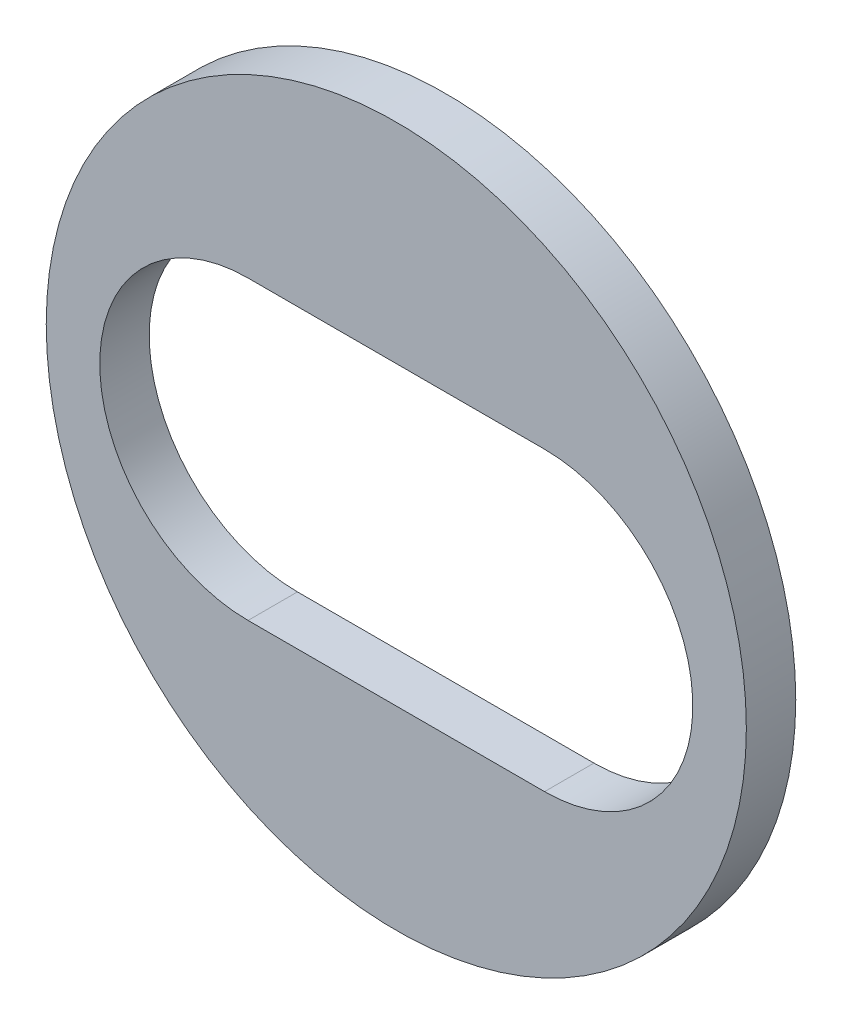
ISO-10303-21;
HEADER;
FILE_DESCRIPTION(('STEP AP214'),'2;1');
FILE_NAME('part.step','',(''),(''),'','','');
FILE_SCHEMA(('AUTOMOTIVE_DESIGN { 1 0 10303 214 1 1 1 1 }'));
ENDSEC;
DATA;
#1=APPLICATION_CONTEXT('core data for automotive mechanical design processes');
#2=APPLICATION_PROTOCOL_DEFINITION('international standard','automotive_design',2000,#1);
#3=PRODUCT_CONTEXT('',#1,'mechanical');
#4=PRODUCT('Part','Part','',(#3));
#5=PRODUCT_RELATED_PRODUCT_CATEGORY('part','',(#4));
#6=PRODUCT_DEFINITION_FORMATION('','',#4);
#7=PRODUCT_DEFINITION_CONTEXT('part definition',#1,'design');
#8=PRODUCT_DEFINITION('design','',#6,#7);
#9=PRODUCT_DEFINITION_SHAPE('','',#8);
#10=(LENGTH_UNIT() NAMED_UNIT(*) SI_UNIT(.MILLI.,.METRE.));
#11=(NAMED_UNIT(*) PLANE_ANGLE_UNIT() SI_UNIT($,.RADIAN.));
#12=(NAMED_UNIT(*) SI_UNIT($,.STERADIAN.) SOLID_ANGLE_UNIT());
#13=UNCERTAINTY_MEASURE_WITH_UNIT(LENGTH_MEASURE(1.E-05),#10,'distance_accuracy_value','');
#14=(GEOMETRIC_REPRESENTATION_CONTEXT(3) GLOBAL_UNCERTAINTY_ASSIGNED_CONTEXT((#13)) GLOBAL_UNIT_ASSIGNED_CONTEXT((#10,
#11,#12)) REPRESENTATION_CONTEXT('',''));
#15=CARTESIAN_POINT('',(0.,0.,0.));
#16=DIRECTION('',(0.,0.,1.));
#17=DIRECTION('',(1.,0.,0.));
#18=AXIS2_PLACEMENT_3D('',#15,#16,#17);
#19=CARTESIAN_POINT('',(0.,0.,6.));
#20=DIRECTION('',(0.,0.,1.));
#21=DIRECTION('',(1.,0.,0.));
#22=AXIS2_PLACEMENT_3D('',#19,#20,#21);
#23=PLANE('',#22);
#24=CARTESIAN_POINT('',(0.,0.,6.));
#25=DIRECTION('',(0.,0.,1.));
#26=DIRECTION('',(1.,0.,0.));
#27=AXIS2_PLACEMENT_3D('',#24,#25,#26);
#28=CIRCLE('',#27,42.5);
#29=CARTESIAN_POINT('',(42.5,0.,6.));
#30=VERTEX_POINT('',#29);
#31=EDGE_CURVE('E115',#30,#30,#28,.T.);
#32=ORIENTED_EDGE('',*,*,#31,.T.);
#33=EDGE_LOOP('',(#32));
#34=FACE_BOUND('',#33,.T.);
#35=DIRECTION('',(1.,0.,0.));
#36=VECTOR('',#35,1.);
#37=CARTESIAN_POINT('',(-18.,-18.899999999907,6.));
#38=LINE('',#37,#36);
#39=CARTESIAN_POINT('',(-18.,-18.899999999907,6.));
#40=VERTEX_POINT('',#39);
#41=CARTESIAN_POINT('',(18.,-18.899999999907,6.));
#42=VERTEX_POINT('',#41);
#43=EDGE_CURVE('E88',#40,#42,#38,.T.);
#44=ORIENTED_EDGE('',*,*,#43,.F.);
#45=CARTESIAN_POINT('',(-18.,-0.899999999907001,6.));
#46=DIRECTION('',(0.,0.,1.));
#47=DIRECTION('',(1.,0.,0.));
#48=AXIS2_PLACEMENT_3D('',#45,#46,#47);
#49=CIRCLE('',#48,18.);
#50=CARTESIAN_POINT('',(-18.,17.100000000093,6.));
#51=VERTEX_POINT('',#50);
#52=EDGE_CURVE('E79',#51,#40,#49,.T.);
#53=ORIENTED_EDGE('',*,*,#52,.F.);
#54=DIRECTION('',(-1.,0.,0.));
#55=VECTOR('',#54,1.);
#56=CARTESIAN_POINT('',(18.,17.100000000093,6.));
#57=LINE('',#56,#55);
#58=CARTESIAN_POINT('',(18.,17.100000000093,6.));
#59=VERTEX_POINT('',#58);
#60=EDGE_CURVE('E104',#59,#51,#57,.T.);
#61=ORIENTED_EDGE('',*,*,#60,.F.);
#62=CARTESIAN_POINT('',(18.,-0.899999999907004,6.));
#63=DIRECTION('',(0.,0.,1.));
#64=DIRECTION('',(1.,0.,0.));
#65=AXIS2_PLACEMENT_3D('',#62,#63,#64);
#66=CIRCLE('',#65,18.);
#67=EDGE_CURVE('E100',#42,#59,#66,.T.);
#68=ORIENTED_EDGE('',*,*,#67,.F.);
#69=EDGE_LOOP('',(#44,#53,#61,#68));
#70=FACE_BOUND('',#69,.T.);
#71=ADVANCED_FACE('F39',(#34,#70),#23,.T.);
#72=CARTESIAN_POINT('',(0.,0.,0.));
#73=DIRECTION('',(0.,0.,1.));
#74=DIRECTION('',(1.,0.,0.));
#75=AXIS2_PLACEMENT_3D('',#72,#73,#74);
#76=PLANE('',#75);
#77=CARTESIAN_POINT('',(0.,0.,0.));
#78=DIRECTION('',(0.,0.,1.));
#79=DIRECTION('',(1.,0.,0.));
#80=AXIS2_PLACEMENT_3D('',#77,#78,#79);
#81=CIRCLE('',#80,42.5);
#82=CARTESIAN_POINT('',(42.5,0.,0.));
#83=VERTEX_POINT('',#82);
#84=EDGE_CURVE('E96',#83,#83,#81,.T.);
#85=ORIENTED_EDGE('',*,*,#84,.F.);
#86=EDGE_LOOP('',(#85));
#87=FACE_BOUND('',#86,.T.);
#88=CARTESIAN_POINT('',(-18.,-0.899999999907001,0.));
#89=DIRECTION('',(0.,0.,1.));
#90=DIRECTION('',(1.,0.,0.));
#91=AXIS2_PLACEMENT_3D('',#88,#89,#90);
#92=CIRCLE('',#91,18.);
#93=CARTESIAN_POINT('',(-18.,-18.899999999907,0.));
#94=VERTEX_POINT('',#93);
#95=CARTESIAN_POINT('',(-18.,17.100000000093,0.));
#96=VERTEX_POINT('',#95);
#97=EDGE_CURVE('E11',#94,#96,#92,.F.);
#98=ORIENTED_EDGE('',*,*,#97,.F.);
#99=DIRECTION('',(-1.,0.,0.));
#100=VECTOR('',#99,1.);
#101=CARTESIAN_POINT('',(0.,-18.899999999907,0.));
#102=LINE('',#101,#100);
#103=CARTESIAN_POINT('',(18.,-18.899999999907,0.));
#104=VERTEX_POINT('',#103);
#105=EDGE_CURVE('E48',#104,#94,#102,.T.);
#106=ORIENTED_EDGE('',*,*,#105,.F.);
#107=CARTESIAN_POINT('',(18.,-0.899999999907004,0.));
#108=DIRECTION('',(0.,0.,1.));
#109=DIRECTION('',(1.,0.,0.));
#110=AXIS2_PLACEMENT_3D('',#107,#108,#109);
#111=CIRCLE('',#110,18.);
#112=CARTESIAN_POINT('',(18.,17.100000000093,0.));
#113=VERTEX_POINT('',#112);
#114=EDGE_CURVE('E125',#113,#104,#111,.F.);
#115=ORIENTED_EDGE('',*,*,#114,.F.);
#116=DIRECTION('',(1.,0.,0.));
#117=VECTOR('',#116,1.);
#118=CARTESIAN_POINT('',(0.,17.100000000093,0.));
#119=LINE('',#118,#117);
#120=EDGE_CURVE('E119',#96,#113,#119,.T.);
#121=ORIENTED_EDGE('',*,*,#120,.F.);
#122=EDGE_LOOP('',(#98,#106,#115,#121));
#123=FACE_BOUND('',#122,.T.);
#124=ADVANCED_FACE('F133',(#87,#123),#76,.F.);
#125=CARTESIAN_POINT('',(0.,0.,6.));
#126=DIRECTION('',(0.,0.,-1.));
#127=DIRECTION('',(-1.,0.,0.));
#128=AXIS2_PLACEMENT_3D('',#125,#126,#127);
#129=CYLINDRICAL_SURFACE('',#128,42.5);
#130=ORIENTED_EDGE('',*,*,#31,.F.);
#131=EDGE_LOOP('',(#130));
#132=FACE_BOUND('',#131,.T.);
#133=ORIENTED_EDGE('',*,*,#84,.T.);
#134=EDGE_LOOP('',(#133));
#135=FACE_BOUND('',#134,.T.);
#136=ADVANCED_FACE('F41',(#132,#135),#129,.T.);
#137=CARTESIAN_POINT('',(-18.,-0.899999999907001,6.));
#138=DIRECTION('',(0.,0.,-1.));
#139=DIRECTION('',(-1.,0.,0.));
#140=AXIS2_PLACEMENT_3D('',#137,#138,#139);
#141=CYLINDRICAL_SURFACE('',#140,18.);
#142=ORIENTED_EDGE('',*,*,#97,.T.);
#143=DIRECTION('',(0.,0.,-1.));
#144=VECTOR('',#143,1.);
#145=CARTESIAN_POINT('',(-18.,17.100000000093,6.));
#146=LINE('',#145,#144);
#147=EDGE_CURVE('E60',#51,#96,#146,.T.);
#148=ORIENTED_EDGE('',*,*,#147,.F.);
#149=ORIENTED_EDGE('',*,*,#52,.T.);
#150=DIRECTION('',(0.,0.,-1.));
#151=VECTOR('',#150,1.);
#152=CARTESIAN_POINT('',(-18.,-18.899999999907,6.));
#153=LINE('',#152,#151);
#154=EDGE_CURVE('E82',#40,#94,#153,.T.);
#155=ORIENTED_EDGE('',*,*,#154,.T.);
#156=EDGE_LOOP('',(#142,#148,#149,#155));
#157=FACE_BOUND('',#156,.T.);
#158=ADVANCED_FACE('F81',(#157),#141,.F.);
#159=CARTESIAN_POINT('',(-18.,-18.899999999907,6.));
#160=DIRECTION('',(0.,1.,0.));
#161=DIRECTION('',(0.,0.,1.));
#162=AXIS2_PLACEMENT_3D('',#159,#160,#161);
#163=PLANE('',#162);
#164=ORIENTED_EDGE('',*,*,#105,.T.);
#165=ORIENTED_EDGE('',*,*,#154,.F.);
#166=ORIENTED_EDGE('',*,*,#43,.T.);
#167=DIRECTION('',(0.,0.,-1.));
#168=VECTOR('',#167,1.);
#169=CARTESIAN_POINT('',(18.,-18.899999999907,6.));
#170=LINE('',#169,#168);
#171=EDGE_CURVE('E97',#42,#104,#170,.T.);
#172=ORIENTED_EDGE('',*,*,#171,.T.);
#173=EDGE_LOOP('',(#164,#165,#166,#172));
#174=FACE_BOUND('',#173,.T.);
#175=ADVANCED_FACE('F91',(#174),#163,.T.);
#176=CARTESIAN_POINT('',(18.,-0.899999999907004,6.));
#177=DIRECTION('',(0.,0.,-1.));
#178=DIRECTION('',(-1.,0.,0.));
#179=AXIS2_PLACEMENT_3D('',#176,#177,#178);
#180=CYLINDRICAL_SURFACE('',#179,18.);
#181=ORIENTED_EDGE('',*,*,#114,.T.);
#182=ORIENTED_EDGE('',*,*,#171,.F.);
#183=ORIENTED_EDGE('',*,*,#67,.T.);
#184=DIRECTION('',(0.,0.,-1.));
#185=VECTOR('',#184,1.);
#186=CARTESIAN_POINT('',(18.,17.100000000093,6.));
#187=LINE('',#186,#185);
#188=EDGE_CURVE('E55',#59,#113,#187,.T.);
#189=ORIENTED_EDGE('',*,*,#188,.T.);
#190=EDGE_LOOP('',(#181,#182,#183,#189));
#191=FACE_BOUND('',#190,.T.);
#192=ADVANCED_FACE('F130',(#191),#180,.F.);
#193=CARTESIAN_POINT('',(18.,17.100000000093,6.));
#194=DIRECTION('',(0.,-1.,0.));
#195=DIRECTION('',(0.,0.,-1.));
#196=AXIS2_PLACEMENT_3D('',#193,#194,#195);
#197=PLANE('',#196);
#198=ORIENTED_EDGE('',*,*,#120,.T.);
#199=ORIENTED_EDGE('',*,*,#188,.F.);
#200=ORIENTED_EDGE('',*,*,#60,.T.);
#201=ORIENTED_EDGE('',*,*,#147,.T.);
#202=EDGE_LOOP('',(#198,#199,#200,#201));
#203=FACE_BOUND('',#202,.T.);
#204=ADVANCED_FACE('F134',(#203),#197,.T.);
#205=CLOSED_SHELL('',(#71,#124,#136,#158,#175,#192,#204));
#206=MANIFOLD_SOLID_BREP('B2',#205);
#207=ADVANCED_BREP_SHAPE_REPRESENTATION('',(#18,#206),#14);
#208=SHAPE_DEFINITION_REPRESENTATION(#9,#207);
ENDSEC;
END-ISO-10303-21;
